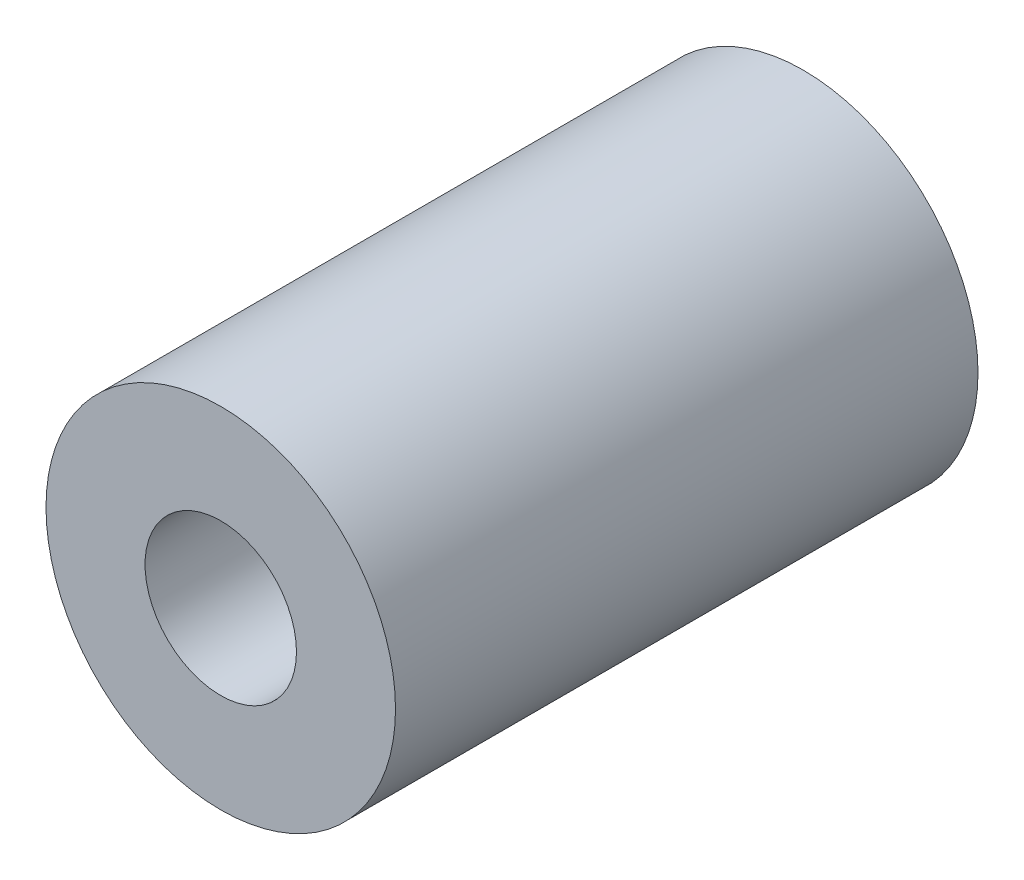
ISO-10303-21;
HEADER;
FILE_DESCRIPTION(('STEP AP214'),'2;1');
FILE_NAME('part.step','',(''),(''),'','','');
FILE_SCHEMA(('AUTOMOTIVE_DESIGN { 1 0 10303 214 1 1 1 1 }'));
ENDSEC;
DATA;
#1=APPLICATION_CONTEXT('core data for automotive mechanical design processes');
#2=APPLICATION_PROTOCOL_DEFINITION('international standard','automotive_design',2000,#1);
#3=PRODUCT_CONTEXT('',#1,'mechanical');
#4=PRODUCT('Part','Part','',(#3));
#5=PRODUCT_RELATED_PRODUCT_CATEGORY('part','',(#4));
#6=PRODUCT_DEFINITION_FORMATION('','',#4);
#7=PRODUCT_DEFINITION_CONTEXT('part definition',#1,'design');
#8=PRODUCT_DEFINITION('design','',#6,#7);
#9=PRODUCT_DEFINITION_SHAPE('','',#8);
#10=(LENGTH_UNIT() NAMED_UNIT(*) SI_UNIT(.MILLI.,.METRE.));
#11=(NAMED_UNIT(*) PLANE_ANGLE_UNIT() SI_UNIT($,.RADIAN.));
#12=(NAMED_UNIT(*) SI_UNIT($,.STERADIAN.) SOLID_ANGLE_UNIT());
#13=UNCERTAINTY_MEASURE_WITH_UNIT(LENGTH_MEASURE(1.E-05),#10,'distance_accuracy_value','');
#14=(GEOMETRIC_REPRESENTATION_CONTEXT(3) GLOBAL_UNCERTAINTY_ASSIGNED_CONTEXT((#13)) GLOBAL_UNIT_ASSIGNED_CONTEXT((#10,
#11,#12)) REPRESENTATION_CONTEXT('',''));
#15=CARTESIAN_POINT('',(0.,0.,0.));
#16=DIRECTION('',(0.,0.,1.));
#17=DIRECTION('',(1.,0.,0.));
#18=AXIS2_PLACEMENT_3D('',#15,#16,#17);
#19=CARTESIAN_POINT('',(0.,0.,10.));
#20=DIRECTION('',(0.,0.,1.));
#21=DIRECTION('',(1.,0.,0.));
#22=AXIS2_PLACEMENT_3D('',#19,#20,#21);
#23=PLANE('',#22);
#24=CARTESIAN_POINT('',(0.,0.,10.));
#25=DIRECTION('',(0.,0.,1.));
#26=DIRECTION('',(1.,0.,0.));
#27=AXIS2_PLACEMENT_3D('',#24,#25,#26);
#28=CIRCLE('',#27,3.);
#29=CARTESIAN_POINT('',(3.,0.,10.));
#30=VERTEX_POINT('',#29);
#31=EDGE_CURVE('E10',#30,#30,#28,.T.);
#32=ORIENTED_EDGE('',*,*,#31,.T.);
#33=EDGE_LOOP('',(#32));
#34=FACE_BOUND('',#33,.T.);
#35=CARTESIAN_POINT('',(0.,0.,10.));
#36=DIRECTION('',(0.,0.,1.));
#37=DIRECTION('',(1.,0.,0.));
#38=AXIS2_PLACEMENT_3D('',#35,#36,#37);
#39=CIRCLE('',#38,1.3);
#40=CARTESIAN_POINT('',(1.3,0.,10.));
#41=VERTEX_POINT('',#40);
#42=EDGE_CURVE('E46',#41,#41,#39,.T.);
#43=ORIENTED_EDGE('',*,*,#42,.F.);
#44=EDGE_LOOP('',(#43));
#45=FACE_BOUND('',#44,.T.);
#46=ADVANCED_FACE('F35',(#34,#45),#23,.T.);
#47=CARTESIAN_POINT('',(0.,0.,0.));
#48=DIRECTION('',(0.,0.,1.));
#49=DIRECTION('',(1.,0.,0.));
#50=AXIS2_PLACEMENT_3D('',#47,#48,#49);
#51=PLANE('',#50);
#52=CARTESIAN_POINT('',(0.,0.,0.));
#53=DIRECTION('',(0.,0.,1.));
#54=DIRECTION('',(1.,0.,0.));
#55=AXIS2_PLACEMENT_3D('',#52,#53,#54);
#56=CIRCLE('',#55,3.);
#57=CARTESIAN_POINT('',(3.,0.,0.));
#58=VERTEX_POINT('',#57);
#59=EDGE_CURVE('E39',#58,#58,#56,.T.);
#60=ORIENTED_EDGE('',*,*,#59,.F.);
#61=EDGE_LOOP('',(#60));
#62=FACE_BOUND('',#61,.T.);
#63=CARTESIAN_POINT('',(0.,0.,0.));
#64=DIRECTION('',(0.,0.,1.));
#65=DIRECTION('',(1.,0.,0.));
#66=AXIS2_PLACEMENT_3D('',#63,#64,#65);
#67=CIRCLE('',#66,1.3);
#68=CARTESIAN_POINT('',(1.3,0.,0.));
#69=VERTEX_POINT('',#68);
#70=EDGE_CURVE('E48',#69,#69,#67,.T.);
#71=ORIENTED_EDGE('',*,*,#70,.T.);
#72=EDGE_LOOP('',(#71));
#73=FACE_BOUND('',#72,.T.);
#74=ADVANCED_FACE('F58',(#62,#73),#51,.F.);
#75=CARTESIAN_POINT('',(0.,0.,10.));
#76=DIRECTION('',(0.,0.,-1.));
#77=DIRECTION('',(-1.,0.,0.));
#78=AXIS2_PLACEMENT_3D('',#75,#76,#77);
#79=CYLINDRICAL_SURFACE('',#78,3.);
#80=ORIENTED_EDGE('',*,*,#31,.F.);
#81=EDGE_LOOP('',(#80));
#82=FACE_BOUND('',#81,.T.);
#83=ORIENTED_EDGE('',*,*,#59,.T.);
#84=EDGE_LOOP('',(#83));
#85=FACE_BOUND('',#84,.T.);
#86=ADVANCED_FACE('F37',(#82,#85),#79,.T.);
#87=CARTESIAN_POINT('',(0.,0.,10.));
#88=DIRECTION('',(0.,0.,-1.));
#89=DIRECTION('',(-1.,0.,0.));
#90=AXIS2_PLACEMENT_3D('',#87,#88,#89);
#91=CYLINDRICAL_SURFACE('',#90,1.3);
#92=ORIENTED_EDGE('',*,*,#42,.T.);
#93=EDGE_LOOP('',(#92));
#94=FACE_BOUND('',#93,.T.);
#95=ORIENTED_EDGE('',*,*,#70,.F.);
#96=EDGE_LOOP('',(#95));
#97=FACE_BOUND('',#96,.T.);
#98=ADVANCED_FACE('F54',(#94,#97),#91,.F.);
#99=CLOSED_SHELL('',(#46,#74,#86,#98));
#100=MANIFOLD_SOLID_BREP('B2',#99);
#101=ADVANCED_BREP_SHAPE_REPRESENTATION('',(#18,#100),#14);
#102=SHAPE_DEFINITION_REPRESENTATION(#9,#101);
ENDSEC;
END-ISO-10303-21;
